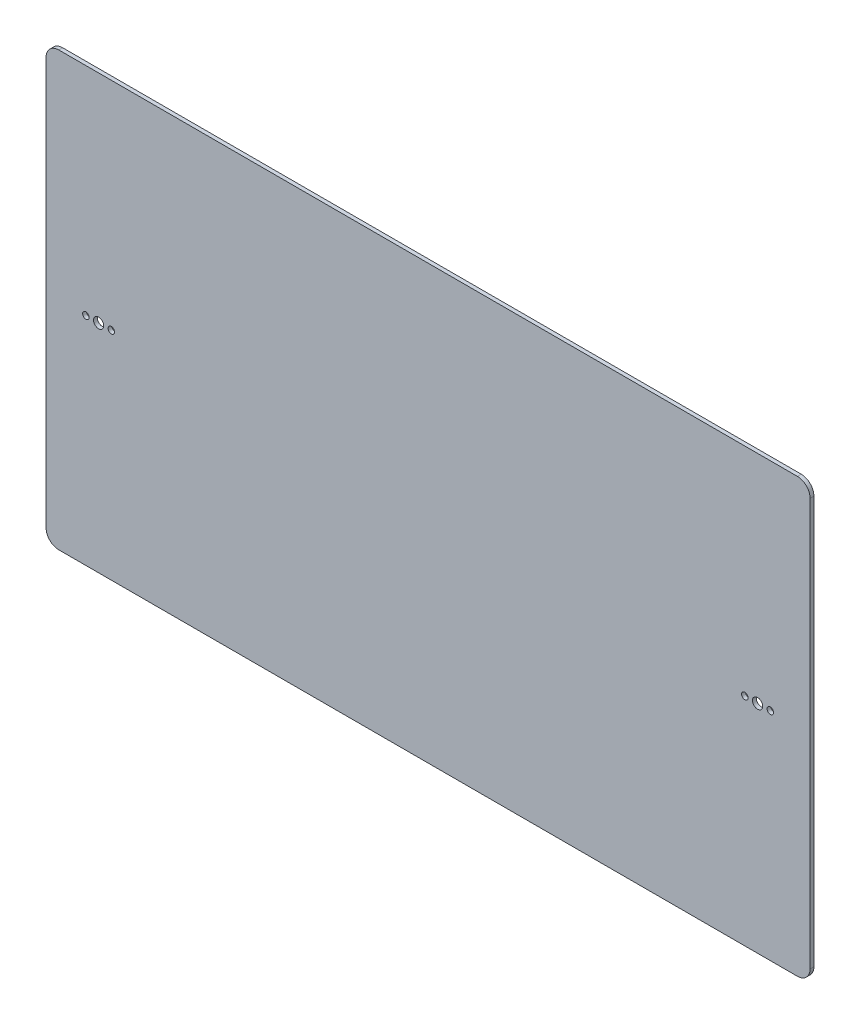
ISO-10303-21;
HEADER;
FILE_DESCRIPTION(('STEP AP214'),'2;1');
FILE_NAME('part.step','',(''),(''),'','','');
FILE_SCHEMA(('AUTOMOTIVE_DESIGN { 1 0 10303 214 1 1 1 1 }'));
ENDSEC;
DATA;
#1=APPLICATION_CONTEXT('core data for automotive mechanical design processes');
#2=APPLICATION_PROTOCOL_DEFINITION('international standard','automotive_design',2000,#1);
#3=PRODUCT_CONTEXT('',#1,'mechanical');
#4=PRODUCT('Part','Part','',(#3));
#5=PRODUCT_RELATED_PRODUCT_CATEGORY('part','',(#4));
#6=PRODUCT_DEFINITION_FORMATION('','',#4);
#7=PRODUCT_DEFINITION_CONTEXT('part definition',#1,'design');
#8=PRODUCT_DEFINITION('design','',#6,#7);
#9=PRODUCT_DEFINITION_SHAPE('','',#8);
#10=(LENGTH_UNIT() NAMED_UNIT(*) SI_UNIT(.MILLI.,.METRE.));
#11=(NAMED_UNIT(*) PLANE_ANGLE_UNIT() SI_UNIT($,.RADIAN.));
#12=(NAMED_UNIT(*) SI_UNIT($,.STERADIAN.) SOLID_ANGLE_UNIT());
#13=UNCERTAINTY_MEASURE_WITH_UNIT(LENGTH_MEASURE(1.E-05),#10,'distance_accuracy_value','');
#14=(GEOMETRIC_REPRESENTATION_CONTEXT(3) GLOBAL_UNCERTAINTY_ASSIGNED_CONTEXT((#13)) GLOBAL_UNIT_ASSIGNED_CONTEXT((#10,
#11,#12)) REPRESENTATION_CONTEXT('',''));
#15=CARTESIAN_POINT('',(0.,0.,0.));
#16=DIRECTION('',(0.,0.,1.));
#17=DIRECTION('',(1.,0.,0.));
#18=AXIS2_PLACEMENT_3D('',#15,#16,#17);
#19=CARTESIAN_POINT('',(290.,160.,3.));
#20=DIRECTION('',(0.,0.,-1.));
#21=DIRECTION('',(-1.,0.,0.));
#22=AXIS2_PLACEMENT_3D('',#19,#20,#21);
#23=PLANE('',#22);
#24=CARTESIAN_POINT('',(290.,160.,3.));
#25=DIRECTION('',(0.,0.,1.));
#26=DIRECTION('',(-1.,0.,0.));
#27=AXIS2_PLACEMENT_3D('',#24,#25,#26);
#28=CIRCLE('',#27,10.);
#29=CARTESIAN_POINT('',(300.,160.,3.));
#30=VERTEX_POINT('',#29);
#31=CARTESIAN_POINT('',(290.,170.,3.));
#32=VERTEX_POINT('',#31);
#33=EDGE_CURVE('E164',#30,#32,#28,.T.);
#34=ORIENTED_EDGE('',*,*,#33,.T.);
#35=DIRECTION('',(-1.,0.,0.));
#36=VECTOR('',#35,1.);
#37=CARTESIAN_POINT('',(-290.,170.,3.));
#38=LINE('',#37,#36);
#39=CARTESIAN_POINT('',(-290.,170.,3.));
#40=VERTEX_POINT('',#39);
#41=EDGE_CURVE('E100',#32,#40,#38,.T.);
#42=ORIENTED_EDGE('',*,*,#41,.T.);
#43=CARTESIAN_POINT('',(-290.,160.,3.));
#44=DIRECTION('',(0.,0.,1.));
#45=DIRECTION('',(1.,0.,0.));
#46=AXIS2_PLACEMENT_3D('',#43,#44,#45);
#47=CIRCLE('',#46,10.);
#48=CARTESIAN_POINT('',(-300.,160.,3.));
#49=VERTEX_POINT('',#48);
#50=EDGE_CURVE('E185',#40,#49,#47,.T.);
#51=ORIENTED_EDGE('',*,*,#50,.T.);
#52=DIRECTION('',(0.,-1.,0.));
#53=VECTOR('',#52,1.);
#54=CARTESIAN_POINT('',(-300.,160.,3.));
#55=LINE('',#54,#53);
#56=CARTESIAN_POINT('',(-300.,-160.,3.));
#57=VERTEX_POINT('',#56);
#58=EDGE_CURVE('E199',#49,#57,#55,.T.);
#59=ORIENTED_EDGE('',*,*,#58,.T.);
#60=CARTESIAN_POINT('',(-290.,-160.,3.));
#61=DIRECTION('',(0.,0.,1.));
#62=DIRECTION('',(1.,0.,0.));
#63=AXIS2_PLACEMENT_3D('',#60,#61,#62);
#64=CIRCLE('',#63,10.);
#65=CARTESIAN_POINT('',(-290.,-170.,3.));
#66=VERTEX_POINT('',#65);
#67=EDGE_CURVE('E119',#57,#66,#64,.T.);
#68=ORIENTED_EDGE('',*,*,#67,.T.);
#69=DIRECTION('',(1.,0.,0.));
#70=VECTOR('',#69,1.);
#71=CARTESIAN_POINT('',(-290.,-170.,3.));
#72=LINE('',#71,#70);
#73=CARTESIAN_POINT('',(290.,-170.,3.));
#74=VERTEX_POINT('',#73);
#75=EDGE_CURVE('E113',#66,#74,#72,.T.);
#76=ORIENTED_EDGE('',*,*,#75,.T.);
#77=CARTESIAN_POINT('',(290.,-160.,3.));
#78=DIRECTION('',(0.,0.,1.));
#79=DIRECTION('',(1.,0.,0.));
#80=AXIS2_PLACEMENT_3D('',#77,#78,#79);
#81=CIRCLE('',#80,10.);
#82=CARTESIAN_POINT('',(300.,-160.,3.));
#83=VERTEX_POINT('',#82);
#84=EDGE_CURVE('E117',#74,#83,#81,.T.);
#85=ORIENTED_EDGE('',*,*,#84,.T.);
#86=DIRECTION('',(0.,1.,0.));
#87=VECTOR('',#86,1.);
#88=CARTESIAN_POINT('',(300.,160.,3.));
#89=LINE('',#88,#87);
#90=EDGE_CURVE('E57',#83,#30,#89,.T.);
#91=ORIENTED_EDGE('',*,*,#90,.T.);
#92=EDGE_LOOP('',(#34,#42,#51,#59,#68,#76,#85,#91));
#93=FACE_BOUND('',#92,.T.);
#94=CARTESIAN_POINT('',(258.75,0.,3.));
#95=DIRECTION('',(0.,0.,1.));
#96=DIRECTION('',(1.,0.,0.));
#97=AXIS2_PLACEMENT_3D('',#94,#95,#96);
#98=CIRCLE('',#97,3.99999999999999);
#99=CARTESIAN_POINT('',(262.75,0.,3.));
#100=VERTEX_POINT('',#99);
#101=EDGE_CURVE('E146',#100,#100,#98,.T.);
#102=ORIENTED_EDGE('',*,*,#101,.F.);
#103=EDGE_LOOP('',(#102));
#104=FACE_BOUND('',#103,.T.);
#105=CARTESIAN_POINT('',(248.75,0.,3.));
#106=DIRECTION('',(0.,0.,1.));
#107=DIRECTION('',(1.,0.,0.));
#108=AXIS2_PLACEMENT_3D('',#105,#106,#107);
#109=CIRCLE('',#108,2.54999999999999);
#110=CARTESIAN_POINT('',(251.3,0.,3.));
#111=VERTEX_POINT('',#110);
#112=EDGE_CURVE('E213',#111,#111,#109,.T.);
#113=ORIENTED_EDGE('',*,*,#112,.F.);
#114=EDGE_LOOP('',(#113));
#115=FACE_BOUND('',#114,.T.);
#116=CARTESIAN_POINT('',(268.75,0.,3.));
#117=DIRECTION('',(0.,0.,1.));
#118=DIRECTION('',(1.,0.,0.));
#119=AXIS2_PLACEMENT_3D('',#116,#117,#118);
#120=CIRCLE('',#119,2.54999999999999);
#121=CARTESIAN_POINT('',(271.3,0.,3.));
#122=VERTEX_POINT('',#121);
#123=EDGE_CURVE('E221',#122,#122,#120,.T.);
#124=ORIENTED_EDGE('',*,*,#123,.F.);
#125=EDGE_LOOP('',(#124));
#126=FACE_BOUND('',#125,.T.);
#127=CARTESIAN_POINT('',(-268.75,-1.77635683940025E-12,3.));
#128=DIRECTION('',(0.,0.,1.));
#129=DIRECTION('',(-1.,0.,0.));
#130=AXIS2_PLACEMENT_3D('',#127,#128,#129);
#131=CIRCLE('',#130,2.54999999999999);
#132=CARTESIAN_POINT('',(-271.3,-1.77635683940025E-12,3.));
#133=VERTEX_POINT('',#132);
#134=EDGE_CURVE('E229',#133,#133,#131,.T.);
#135=ORIENTED_EDGE('',*,*,#134,.F.);
#136=EDGE_LOOP('',(#135));
#137=FACE_BOUND('',#136,.T.);
#138=CARTESIAN_POINT('',(-248.75,-1.77635683940025E-12,3.));
#139=DIRECTION('',(0.,0.,1.));
#140=DIRECTION('',(-1.,0.,0.));
#141=AXIS2_PLACEMENT_3D('',#138,#139,#140);
#142=CIRCLE('',#141,2.54999999999999);
#143=CARTESIAN_POINT('',(-251.3,-1.77635683940025E-12,3.));
#144=VERTEX_POINT('',#143);
#145=EDGE_CURVE('E237',#144,#144,#142,.T.);
#146=ORIENTED_EDGE('',*,*,#145,.F.);
#147=EDGE_LOOP('',(#146));
#148=FACE_BOUND('',#147,.T.);
#149=CARTESIAN_POINT('',(-258.75,-1.77635683940025E-12,3.));
#150=DIRECTION('',(0.,0.,1.));
#151=DIRECTION('',(-1.,0.,0.));
#152=AXIS2_PLACEMENT_3D('',#149,#150,#151);
#153=CIRCLE('',#152,3.99999999999999);
#154=CARTESIAN_POINT('',(-262.75,-1.77635683940025E-12,3.));
#155=VERTEX_POINT('',#154);
#156=EDGE_CURVE('E245',#155,#155,#153,.T.);
#157=ORIENTED_EDGE('',*,*,#156,.F.);
#158=EDGE_LOOP('',(#157));
#159=FACE_BOUND('',#158,.T.);
#160=ADVANCED_FACE('F39',(#93,#104,#115,#126,#137,#148,#159),#23,.F.);
#161=CARTESIAN_POINT('',(290.,160.,0.));
#162=DIRECTION('',(0.,0.,-1.));
#163=DIRECTION('',(-1.,0.,0.));
#164=AXIS2_PLACEMENT_3D('',#161,#162,#163);
#165=PLANE('',#164);
#166=CARTESIAN_POINT('',(-248.75,-1.77635683940025E-12,0.));
#167=DIRECTION('',(0.,0.,1.));
#168=DIRECTION('',(-1.,0.,0.));
#169=AXIS2_PLACEMENT_3D('',#166,#167,#168);
#170=CIRCLE('',#169,2.54999999999999);
#171=CARTESIAN_POINT('',(-251.3,-1.77635683940025E-12,0.));
#172=VERTEX_POINT('',#171);
#173=EDGE_CURVE('E241',#172,#172,#170,.T.);
#174=ORIENTED_EDGE('',*,*,#173,.T.);
#175=EDGE_LOOP('',(#174));
#176=FACE_BOUND('',#175,.T.);
#177=CARTESIAN_POINT('',(268.75,0.,0.));
#178=DIRECTION('',(0.,0.,1.));
#179=DIRECTION('',(1.,0.,0.));
#180=AXIS2_PLACEMENT_3D('',#177,#178,#179);
#181=CIRCLE('',#180,2.54999999999999);
#182=CARTESIAN_POINT('',(271.3,0.,0.));
#183=VERTEX_POINT('',#182);
#184=EDGE_CURVE('E225',#183,#183,#181,.T.);
#185=ORIENTED_EDGE('',*,*,#184,.T.);
#186=EDGE_LOOP('',(#185));
#187=FACE_BOUND('',#186,.T.);
#188=CARTESIAN_POINT('',(258.75,0.,0.));
#189=DIRECTION('',(0.,0.,1.));
#190=DIRECTION('',(1.,0.,0.));
#191=AXIS2_PLACEMENT_3D('',#188,#189,#190);
#192=CIRCLE('',#191,3.99999999999999);
#193=CARTESIAN_POINT('',(262.75,0.,0.));
#194=VERTEX_POINT('',#193);
#195=EDGE_CURVE('E209',#194,#194,#192,.T.);
#196=ORIENTED_EDGE('',*,*,#195,.T.);
#197=EDGE_LOOP('',(#196));
#198=FACE_BOUND('',#197,.T.);
#199=CARTESIAN_POINT('',(290.,160.,0.));
#200=DIRECTION('',(0.,0.,1.));
#201=DIRECTION('',(-1.,0.,0.));
#202=AXIS2_PLACEMENT_3D('',#199,#200,#201);
#203=CIRCLE('',#202,10.);
#204=CARTESIAN_POINT('',(300.,160.,0.));
#205=VERTEX_POINT('',#204);
#206=CARTESIAN_POINT('',(290.,170.,0.));
#207=VERTEX_POINT('',#206);
#208=EDGE_CURVE('E141',#205,#207,#203,.T.);
#209=ORIENTED_EDGE('',*,*,#208,.F.);
#210=DIRECTION('',(0.,1.,0.));
#211=VECTOR('',#210,1.);
#212=CARTESIAN_POINT('',(300.,160.,0.));
#213=LINE('',#212,#211);
#214=CARTESIAN_POINT('',(300.,-160.,0.));
#215=VERTEX_POINT('',#214);
#216=EDGE_CURVE('E92',#215,#205,#213,.T.);
#217=ORIENTED_EDGE('',*,*,#216,.F.);
#218=CARTESIAN_POINT('',(290.,-160.,0.));
#219=DIRECTION('',(0.,0.,1.));
#220=DIRECTION('',(1.,0.,0.));
#221=AXIS2_PLACEMENT_3D('',#218,#219,#220);
#222=CIRCLE('',#221,10.);
#223=CARTESIAN_POINT('',(290.,-170.,0.));
#224=VERTEX_POINT('',#223);
#225=EDGE_CURVE('E86',#224,#215,#222,.T.);
#226=ORIENTED_EDGE('',*,*,#225,.F.);
#227=DIRECTION('',(1.,0.,0.));
#228=VECTOR('',#227,1.);
#229=CARTESIAN_POINT('',(-290.,-170.,0.));
#230=LINE('',#229,#228);
#231=CARTESIAN_POINT('',(-290.,-170.,0.));
#232=VERTEX_POINT('',#231);
#233=EDGE_CURVE('E128',#232,#224,#230,.T.);
#234=ORIENTED_EDGE('',*,*,#233,.F.);
#235=CARTESIAN_POINT('',(-290.,-160.,0.));
#236=DIRECTION('',(0.,0.,1.));
#237=DIRECTION('',(1.,0.,0.));
#238=AXIS2_PLACEMENT_3D('',#235,#236,#237);
#239=CIRCLE('',#238,10.);
#240=CARTESIAN_POINT('',(-300.,-160.,0.));
#241=VERTEX_POINT('',#240);
#242=EDGE_CURVE('E155',#241,#232,#239,.T.);
#243=ORIENTED_EDGE('',*,*,#242,.F.);
#244=DIRECTION('',(0.,-1.,0.));
#245=VECTOR('',#244,1.);
#246=CARTESIAN_POINT('',(-300.,160.,0.));
#247=LINE('',#246,#245);
#248=CARTESIAN_POINT('',(-300.,160.,0.));
#249=VERTEX_POINT('',#248);
#250=EDGE_CURVE('E152',#249,#241,#247,.T.);
#251=ORIENTED_EDGE('',*,*,#250,.F.);
#252=CARTESIAN_POINT('',(-290.,160.,0.));
#253=DIRECTION('',(0.,0.,1.));
#254=DIRECTION('',(1.,0.,0.));
#255=AXIS2_PLACEMENT_3D('',#252,#253,#254);
#256=CIRCLE('',#255,10.);
#257=CARTESIAN_POINT('',(-290.,170.,0.));
#258=VERTEX_POINT('',#257);
#259=EDGE_CURVE('E149',#258,#249,#256,.T.);
#260=ORIENTED_EDGE('',*,*,#259,.F.);
#261=DIRECTION('',(-1.,0.,0.));
#262=VECTOR('',#261,1.);
#263=CARTESIAN_POINT('',(-290.,170.,0.));
#264=LINE('',#263,#262);
#265=EDGE_CURVE('E145',#207,#258,#264,.T.);
#266=ORIENTED_EDGE('',*,*,#265,.F.);
#267=EDGE_LOOP('',(#209,#217,#226,#234,#243,#251,#260,#266));
#268=FACE_BOUND('',#267,.T.);
#269=CARTESIAN_POINT('',(248.75,0.,0.));
#270=DIRECTION('',(0.,0.,1.));
#271=DIRECTION('',(1.,0.,0.));
#272=AXIS2_PLACEMENT_3D('',#269,#270,#271);
#273=CIRCLE('',#272,2.54999999999999);
#274=CARTESIAN_POINT('',(251.3,0.,0.));
#275=VERTEX_POINT('',#274);
#276=EDGE_CURVE('E217',#275,#275,#273,.T.);
#277=ORIENTED_EDGE('',*,*,#276,.T.);
#278=EDGE_LOOP('',(#277));
#279=FACE_BOUND('',#278,.T.);
#280=CARTESIAN_POINT('',(-268.75,-1.77635683940025E-12,0.));
#281=DIRECTION('',(0.,0.,1.));
#282=DIRECTION('',(-1.,0.,0.));
#283=AXIS2_PLACEMENT_3D('',#280,#281,#282);
#284=CIRCLE('',#283,2.54999999999999);
#285=CARTESIAN_POINT('',(-271.3,-1.77635683940025E-12,0.));
#286=VERTEX_POINT('',#285);
#287=EDGE_CURVE('E233',#286,#286,#284,.T.);
#288=ORIENTED_EDGE('',*,*,#287,.T.);
#289=EDGE_LOOP('',(#288));
#290=FACE_BOUND('',#289,.T.);
#291=CARTESIAN_POINT('',(-258.75,-1.77635683940025E-12,0.));
#292=DIRECTION('',(0.,0.,1.));
#293=DIRECTION('',(-1.,0.,0.));
#294=AXIS2_PLACEMENT_3D('',#291,#292,#293);
#295=CIRCLE('',#294,3.99999999999999);
#296=CARTESIAN_POINT('',(-262.75,-1.77635683940025E-12,0.));
#297=VERTEX_POINT('',#296);
#298=EDGE_CURVE('E249',#297,#297,#295,.T.);
#299=ORIENTED_EDGE('',*,*,#298,.T.);
#300=EDGE_LOOP('',(#299));
#301=FACE_BOUND('',#300,.T.);
#302=ADVANCED_FACE('F189',(#176,#187,#198,#268,#279,#290,#301),#165,.T.);
#303=CARTESIAN_POINT('',(290.,160.,3.));
#304=DIRECTION('',(0.,0.,-1.));
#305=DIRECTION('',(-1.,0.,0.));
#306=AXIS2_PLACEMENT_3D('',#303,#304,#305);
#307=CYLINDRICAL_SURFACE('',#306,10.);
#308=ORIENTED_EDGE('',*,*,#208,.T.);
#309=DIRECTION('',(0.,0.,-1.));
#310=VECTOR('',#309,1.);
#311=CARTESIAN_POINT('',(290.,170.,3.));
#312=LINE('',#311,#310);
#313=EDGE_CURVE('E11',#32,#207,#312,.T.);
#314=ORIENTED_EDGE('',*,*,#313,.F.);
#315=ORIENTED_EDGE('',*,*,#33,.F.);
#316=DIRECTION('',(0.,0.,-1.));
#317=VECTOR('',#316,1.);
#318=CARTESIAN_POINT('',(300.,160.,3.));
#319=LINE('',#318,#317);
#320=EDGE_CURVE('E137',#30,#205,#319,.T.);
#321=ORIENTED_EDGE('',*,*,#320,.T.);
#322=EDGE_LOOP('',(#308,#314,#315,#321));
#323=FACE_BOUND('',#322,.T.);
#324=ADVANCED_FACE('F41',(#323),#307,.T.);
#325=CARTESIAN_POINT('',(-290.,170.,3.));
#326=DIRECTION('',(0.,-1.,0.));
#327=DIRECTION('',(0.,0.,-1.));
#328=AXIS2_PLACEMENT_3D('',#325,#326,#327);
#329=PLANE('',#328);
#330=ORIENTED_EDGE('',*,*,#265,.T.);
#331=DIRECTION('',(0.,0.,-1.));
#332=VECTOR('',#331,1.);
#333=CARTESIAN_POINT('',(-290.,170.,3.));
#334=LINE('',#333,#332);
#335=EDGE_CURVE('E49',#40,#258,#334,.T.);
#336=ORIENTED_EDGE('',*,*,#335,.F.);
#337=ORIENTED_EDGE('',*,*,#41,.F.);
#338=ORIENTED_EDGE('',*,*,#313,.T.);
#339=EDGE_LOOP('',(#330,#336,#337,#338));
#340=FACE_BOUND('',#339,.T.);
#341=ADVANCED_FACE('F283',(#340),#329,.F.);
#342=CARTESIAN_POINT('',(-290.,160.,3.));
#343=DIRECTION('',(0.,0.,-1.));
#344=DIRECTION('',(-1.,0.,0.));
#345=AXIS2_PLACEMENT_3D('',#342,#343,#344);
#346=CYLINDRICAL_SURFACE('',#345,10.);
#347=ORIENTED_EDGE('',*,*,#259,.T.);
#348=DIRECTION('',(0.,0.,-1.));
#349=VECTOR('',#348,1.);
#350=CARTESIAN_POINT('',(-300.,160.,3.));
#351=LINE('',#350,#349);
#352=EDGE_CURVE('E175',#49,#249,#351,.T.);
#353=ORIENTED_EDGE('',*,*,#352,.F.);
#354=ORIENTED_EDGE('',*,*,#50,.F.);
#355=ORIENTED_EDGE('',*,*,#335,.T.);
#356=EDGE_LOOP('',(#347,#353,#354,#355));
#357=FACE_BOUND('',#356,.T.);
#358=ADVANCED_FACE('F183',(#357),#346,.T.);
#359=CARTESIAN_POINT('',(-300.,160.,3.));
#360=DIRECTION('',(1.,0.,0.));
#361=DIRECTION('',(0.,1.,0.));
#362=AXIS2_PLACEMENT_3D('',#359,#360,#361);
#363=PLANE('',#362);
#364=ORIENTED_EDGE('',*,*,#250,.T.);
#365=DIRECTION('',(0.,0.,-1.));
#366=VECTOR('',#365,1.);
#367=CARTESIAN_POINT('',(-300.,-160.,3.));
#368=LINE('',#367,#366);
#369=EDGE_CURVE('E171',#57,#241,#368,.T.);
#370=ORIENTED_EDGE('',*,*,#369,.F.);
#371=ORIENTED_EDGE('',*,*,#58,.F.);
#372=ORIENTED_EDGE('',*,*,#352,.T.);
#373=EDGE_LOOP('',(#364,#370,#371,#372));
#374=FACE_BOUND('',#373,.T.);
#375=ADVANCED_FACE('F194',(#374),#363,.F.);
#376=CARTESIAN_POINT('',(-290.,-160.,3.));
#377=DIRECTION('',(0.,0.,-1.));
#378=DIRECTION('',(-1.,0.,0.));
#379=AXIS2_PLACEMENT_3D('',#376,#377,#378);
#380=CYLINDRICAL_SURFACE('',#379,10.);
#381=ORIENTED_EDGE('',*,*,#242,.T.);
#382=DIRECTION('',(0.,0.,-1.));
#383=VECTOR('',#382,1.);
#384=CARTESIAN_POINT('',(-290.,-170.,3.));
#385=LINE('',#384,#383);
#386=EDGE_CURVE('E130',#66,#232,#385,.T.);
#387=ORIENTED_EDGE('',*,*,#386,.F.);
#388=ORIENTED_EDGE('',*,*,#67,.F.);
#389=ORIENTED_EDGE('',*,*,#369,.T.);
#390=EDGE_LOOP('',(#381,#387,#388,#389));
#391=FACE_BOUND('',#390,.T.);
#392=ADVANCED_FACE('F197',(#391),#380,.T.);
#393=CARTESIAN_POINT('',(-290.,-170.,3.));
#394=DIRECTION('',(0.,1.,0.));
#395=DIRECTION('',(0.,0.,1.));
#396=AXIS2_PLACEMENT_3D('',#393,#394,#395);
#397=PLANE('',#396);
#398=ORIENTED_EDGE('',*,*,#233,.T.);
#399=DIRECTION('',(0.,0.,-1.));
#400=VECTOR('',#399,1.);
#401=CARTESIAN_POINT('',(290.,-170.,3.));
#402=LINE('',#401,#400);
#403=EDGE_CURVE('E125',#74,#224,#402,.T.);
#404=ORIENTED_EDGE('',*,*,#403,.F.);
#405=ORIENTED_EDGE('',*,*,#75,.F.);
#406=ORIENTED_EDGE('',*,*,#386,.T.);
#407=EDGE_LOOP('',(#398,#404,#405,#406));
#408=FACE_BOUND('',#407,.T.);
#409=ADVANCED_FACE('F126',(#408),#397,.F.);
#410=CARTESIAN_POINT('',(290.,-160.,3.));
#411=DIRECTION('',(0.,0.,-1.));
#412=DIRECTION('',(-1.,0.,0.));
#413=AXIS2_PLACEMENT_3D('',#410,#411,#412);
#414=CYLINDRICAL_SURFACE('',#413,10.);
#415=ORIENTED_EDGE('',*,*,#225,.T.);
#416=DIRECTION('',(0.,0.,-1.));
#417=VECTOR('',#416,1.);
#418=CARTESIAN_POINT('',(300.,-160.,3.));
#419=LINE('',#418,#417);
#420=EDGE_CURVE('E131',#83,#215,#419,.T.);
#421=ORIENTED_EDGE('',*,*,#420,.F.);
#422=ORIENTED_EDGE('',*,*,#84,.F.);
#423=ORIENTED_EDGE('',*,*,#403,.T.);
#424=EDGE_LOOP('',(#415,#421,#422,#423));
#425=FACE_BOUND('',#424,.T.);
#426=ADVANCED_FACE('F133',(#425),#414,.T.);
#427=CARTESIAN_POINT('',(300.,160.,3.));
#428=DIRECTION('',(-1.,0.,0.));
#429=DIRECTION('',(0.,0.,1.));
#430=AXIS2_PLACEMENT_3D('',#427,#428,#429);
#431=PLANE('',#430);
#432=ORIENTED_EDGE('',*,*,#216,.T.);
#433=ORIENTED_EDGE('',*,*,#320,.F.);
#434=ORIENTED_EDGE('',*,*,#90,.F.);
#435=ORIENTED_EDGE('',*,*,#420,.T.);
#436=EDGE_LOOP('',(#432,#433,#434,#435));
#437=FACE_BOUND('',#436,.T.);
#438=ADVANCED_FACE('F271',(#437),#431,.F.);
#439=CARTESIAN_POINT('',(258.75,0.,3.));
#440=DIRECTION('',(0.,0.,-1.));
#441=DIRECTION('',(-1.,0.,0.));
#442=AXIS2_PLACEMENT_3D('',#439,#440,#441);
#443=CYLINDRICAL_SURFACE('',#442,3.99999999999999);
#444=ORIENTED_EDGE('',*,*,#101,.T.);
#445=EDGE_LOOP('',(#444));
#446=FACE_BOUND('',#445,.T.);
#447=ORIENTED_EDGE('',*,*,#195,.F.);
#448=EDGE_LOOP('',(#447));
#449=FACE_BOUND('',#448,.T.);
#450=ADVANCED_FACE('F268',(#446,#449),#443,.F.);
#451=CARTESIAN_POINT('',(248.75,0.,3.));
#452=DIRECTION('',(0.,0.,-1.));
#453=DIRECTION('',(-1.,0.,0.));
#454=AXIS2_PLACEMENT_3D('',#451,#452,#453);
#455=CYLINDRICAL_SURFACE('',#454,2.54999999999999);
#456=ORIENTED_EDGE('',*,*,#112,.T.);
#457=EDGE_LOOP('',(#456));
#458=FACE_BOUND('',#457,.T.);
#459=ORIENTED_EDGE('',*,*,#276,.F.);
#460=EDGE_LOOP('',(#459));
#461=FACE_BOUND('',#460,.T.);
#462=ADVANCED_FACE('F347',(#458,#461),#455,.F.);
#463=CARTESIAN_POINT('',(268.75,0.,3.));
#464=DIRECTION('',(0.,0.,-1.));
#465=DIRECTION('',(-1.,0.,0.));
#466=AXIS2_PLACEMENT_3D('',#463,#464,#465);
#467=CYLINDRICAL_SURFACE('',#466,2.54999999999999);
#468=ORIENTED_EDGE('',*,*,#123,.T.);
#469=EDGE_LOOP('',(#468));
#470=FACE_BOUND('',#469,.T.);
#471=ORIENTED_EDGE('',*,*,#184,.F.);
#472=EDGE_LOOP('',(#471));
#473=FACE_BOUND('',#472,.T.);
#474=ADVANCED_FACE('F355',(#470,#473),#467,.F.);
#475=CARTESIAN_POINT('',(-268.75,-1.77635683940025E-12,3.));
#476=DIRECTION('',(0.,0.,-1.));
#477=DIRECTION('',(-1.,0.,0.));
#478=AXIS2_PLACEMENT_3D('',#475,#476,#477);
#479=CYLINDRICAL_SURFACE('',#478,2.54999999999999);
#480=ORIENTED_EDGE('',*,*,#134,.T.);
#481=EDGE_LOOP('',(#480));
#482=FACE_BOUND('',#481,.T.);
#483=ORIENTED_EDGE('',*,*,#287,.F.);
#484=EDGE_LOOP('',(#483));
#485=FACE_BOUND('',#484,.T.);
#486=ADVANCED_FACE('F363',(#482,#485),#479,.F.);
#487=CARTESIAN_POINT('',(-248.75,-1.77635683940025E-12,3.));
#488=DIRECTION('',(0.,0.,-1.));
#489=DIRECTION('',(-1.,0.,0.));
#490=AXIS2_PLACEMENT_3D('',#487,#488,#489);
#491=CYLINDRICAL_SURFACE('',#490,2.54999999999999);
#492=ORIENTED_EDGE('',*,*,#145,.T.);
#493=EDGE_LOOP('',(#492));
#494=FACE_BOUND('',#493,.T.);
#495=ORIENTED_EDGE('',*,*,#173,.F.);
#496=EDGE_LOOP('',(#495));
#497=FACE_BOUND('',#496,.T.);
#498=ADVANCED_FACE('F372',(#494,#497),#491,.F.);
#499=CARTESIAN_POINT('',(-258.75,-1.77635683940025E-12,3.));
#500=DIRECTION('',(0.,0.,-1.));
#501=DIRECTION('',(-1.,0.,0.));
#502=AXIS2_PLACEMENT_3D('',#499,#500,#501);
#503=CYLINDRICAL_SURFACE('',#502,3.99999999999999);
#504=ORIENTED_EDGE('',*,*,#156,.T.);
#505=EDGE_LOOP('',(#504));
#506=FACE_BOUND('',#505,.T.);
#507=ORIENTED_EDGE('',*,*,#298,.F.);
#508=EDGE_LOOP('',(#507));
#509=FACE_BOUND('',#508,.T.);
#510=ADVANCED_FACE('F257',(#506,#509),#503,.F.);
#511=CLOSED_SHELL('',(#160,#302,#324,#341,#358,#375,#392,#409,#426,#438,#450,#462,#474,#486,
#498,#510));
#512=MANIFOLD_SOLID_BREP('B2',#511);
#513=ADVANCED_BREP_SHAPE_REPRESENTATION('',(#18,#512),#14);
#514=SHAPE_DEFINITION_REPRESENTATION(#9,#513);
ENDSEC;
END-ISO-10303-21;
